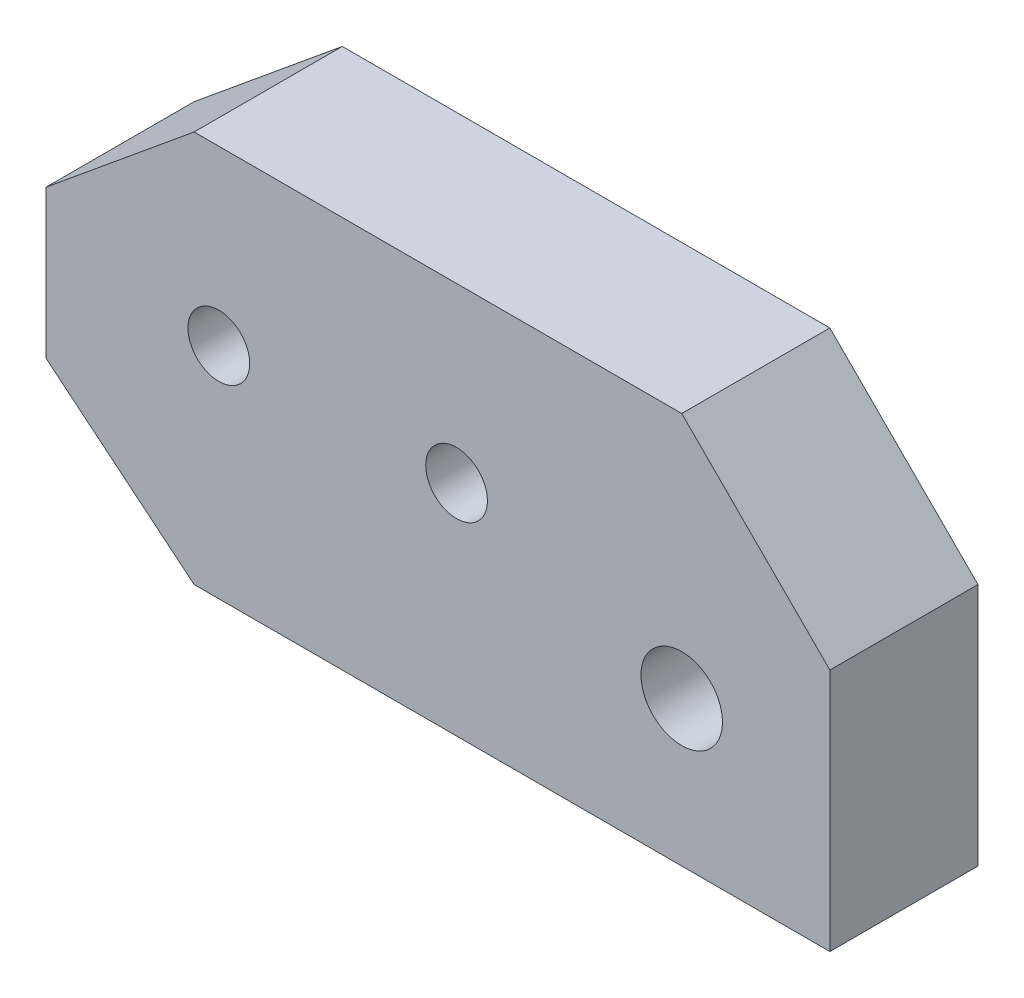
ISO-10303-21;
HEADER;
FILE_DESCRIPTION(('STEP AP214'),'2;1');
FILE_NAME('part.step','',(''),(''),'','','');
FILE_SCHEMA(('AUTOMOTIVE_DESIGN { 1 0 10303 214 1 1 1 1 }'));
ENDSEC;
DATA;
#1=APPLICATION_CONTEXT('core data for automotive mechanical design processes');
#2=APPLICATION_PROTOCOL_DEFINITION('international standard','automotive_design',2000,#1);
#3=PRODUCT_CONTEXT('',#1,'mechanical');
#4=PRODUCT('Part','Part','',(#3));
#5=PRODUCT_RELATED_PRODUCT_CATEGORY('part','',(#4));
#6=PRODUCT_DEFINITION_FORMATION('','',#4);
#7=PRODUCT_DEFINITION_CONTEXT('part definition',#1,'design');
#8=PRODUCT_DEFINITION('design','',#6,#7);
#9=PRODUCT_DEFINITION_SHAPE('','',#8);
#10=(LENGTH_UNIT() NAMED_UNIT(*) SI_UNIT(.MILLI.,.METRE.));
#11=(NAMED_UNIT(*) PLANE_ANGLE_UNIT() SI_UNIT($,.RADIAN.));
#12=(NAMED_UNIT(*) SI_UNIT($,.STERADIAN.) SOLID_ANGLE_UNIT());
#13=UNCERTAINTY_MEASURE_WITH_UNIT(LENGTH_MEASURE(1.E-05),#10,'distance_accuracy_value','');
#14=(GEOMETRIC_REPRESENTATION_CONTEXT(3) GLOBAL_UNCERTAINTY_ASSIGNED_CONTEXT((#13)) GLOBAL_UNIT_ASSIGNED_CONTEXT((#10,
#11,#12)) REPRESENTATION_CONTEXT('',''));
#15=CARTESIAN_POINT('',(0.,0.,0.));
#16=DIRECTION('',(0.,0.,1.));
#17=DIRECTION('',(1.,0.,0.));
#18=AXIS2_PLACEMENT_3D('',#15,#16,#17);
#19=CARTESIAN_POINT('',(0.,0.,-6.));
#20=DIRECTION('',(0.,0.,1.));
#21=DIRECTION('',(1.,0.,0.));
#22=AXIS2_PLACEMENT_3D('',#19,#20,#21);
#23=PLANE('',#22);
#24=CARTESIAN_POINT('',(19.7484392802478,-4.12500000000007,-6.));
#25=DIRECTION('',(0.,0.,-1.));
#26=DIRECTION('',(-1.,0.,0.));
#27=AXIS2_PLACEMENT_3D('',#24,#25,#26);
#28=CIRCLE('',#27,3.3);
#29=CARTESIAN_POINT('',(16.4484392802478,-4.12500000000007,-6.));
#30=VERTEX_POINT('',#29);
#31=EDGE_CURVE('E190',#30,#30,#28,.T.);
#32=ORIENTED_EDGE('',*,*,#31,.F.);
#33=EDGE_LOOP('',(#32));
#34=FACE_BOUND('',#33,.T.);
#35=DIRECTION('',(0.,1.,0.));
#36=VECTOR('',#35,1.);
#37=CARTESIAN_POINT('',(31.75,-15.875,-6.));
#38=LINE('',#37,#36);
#39=CARTESIAN_POINT('',(31.75,-15.875,-6.));
#40=VERTEX_POINT('',#39);
#41=CARTESIAN_POINT('',(31.75,3.87499999999999,-6.));
#42=VERTEX_POINT('',#41);
#43=EDGE_CURVE('E140',#40,#42,#38,.T.);
#44=ORIENTED_EDGE('',*,*,#43,.F.);
#45=DIRECTION('',(1.,0.,0.));
#46=VECTOR('',#45,1.);
#47=CARTESIAN_POINT('',(31.75,-15.875,-6.));
#48=LINE('',#47,#46);
#49=CARTESIAN_POINT('',(-19.75,-15.875,-6.));
#50=VERTEX_POINT('',#49);
#51=EDGE_CURVE('E98',#50,#40,#48,.T.);
#52=ORIENTED_EDGE('',*,*,#51,.F.);
#53=DIRECTION('',(0.772162363536845,-0.635425278327195,0.));
#54=VECTOR('',#53,1.);
#55=CARTESIAN_POINT('',(-31.75,-6.,-6.));
#56=LINE('',#55,#54);
#57=CARTESIAN_POINT('',(-31.75,-6.,-6.));
#58=VERTEX_POINT('',#57);
#59=EDGE_CURVE('E92',#58,#50,#56,.T.);
#60=ORIENTED_EDGE('',*,*,#59,.F.);
#61=DIRECTION('',(0.,-1.,0.));
#62=VECTOR('',#61,1.);
#63=CARTESIAN_POINT('',(-31.75,6.,-6.));
#64=LINE('',#63,#62);
#65=CARTESIAN_POINT('',(-31.75,6.,-6.));
#66=VERTEX_POINT('',#65);
#67=EDGE_CURVE('E130',#66,#58,#64,.T.);
#68=ORIENTED_EDGE('',*,*,#67,.F.);
#69=DIRECTION('',(-0.772162363536845,-0.635425278327195,0.));
#70=VECTOR('',#69,1.);
#71=CARTESIAN_POINT('',(-31.75,6.,-6.));
#72=LINE('',#71,#70);
#73=CARTESIAN_POINT('',(-19.75,15.875,-6.));
#74=VERTEX_POINT('',#73);
#75=EDGE_CURVE('E148',#74,#66,#72,.T.);
#76=ORIENTED_EDGE('',*,*,#75,.F.);
#77=DIRECTION('',(-1.,0.,0.));
#78=VECTOR('',#77,1.);
#79=CARTESIAN_POINT('',(19.75,15.875,-6.));
#80=LINE('',#79,#78);
#81=CARTESIAN_POINT('',(19.75,15.875,-6.));
#82=VERTEX_POINT('',#81);
#83=EDGE_CURVE('E146',#82,#74,#80,.T.);
#84=ORIENTED_EDGE('',*,*,#83,.F.);
#85=DIRECTION('',(-0.707106781186548,0.707106781186547,0.));
#86=VECTOR('',#85,1.);
#87=CARTESIAN_POINT('',(19.75,15.875,-6.));
#88=LINE('',#87,#86);
#89=EDGE_CURVE('E143',#42,#82,#88,.T.);
#90=ORIENTED_EDGE('',*,*,#89,.F.);
#91=EDGE_LOOP('',(#44,#52,#60,#68,#76,#84,#90));
#92=FACE_BOUND('',#91,.T.);
#93=CARTESIAN_POINT('',(1.51,1.87499999999999,-6.));
#94=DIRECTION('',(0.,0.,-1.));
#95=DIRECTION('',(-1.,0.,0.));
#96=AXIS2_PLACEMENT_3D('',#93,#94,#95);
#97=CIRCLE('',#96,2.5);
#98=CARTESIAN_POINT('',(-0.989999999999994,1.87499999999999,-6.));
#99=VERTEX_POINT('',#98);
#100=EDGE_CURVE('E178',#99,#99,#97,.T.);
#101=ORIENTED_EDGE('',*,*,#100,.F.);
#102=EDGE_LOOP('',(#101));
#103=FACE_BOUND('',#102,.T.);
#104=CARTESIAN_POINT('',(-17.75,1.87499999999999,-6.));
#105=DIRECTION('',(0.,0.,-1.));
#106=DIRECTION('',(-1.,0.,0.));
#107=AXIS2_PLACEMENT_3D('',#104,#105,#106);
#108=CIRCLE('',#107,2.5);
#109=CARTESIAN_POINT('',(-20.25,1.87499999999999,-6.));
#110=VERTEX_POINT('',#109);
#111=EDGE_CURVE('E184',#110,#110,#108,.T.);
#112=ORIENTED_EDGE('',*,*,#111,.F.);
#113=EDGE_LOOP('',(#112));
#114=FACE_BOUND('',#113,.T.);
#115=ADVANCED_FACE('F49',(#34,#92,#103,#114),#23,.F.);
#116=CARTESIAN_POINT('',(31.75,-15.875,6.));
#117=DIRECTION('',(-1.,0.,0.));
#118=DIRECTION('',(0.,0.,1.));
#119=AXIS2_PLACEMENT_3D('',#116,#117,#118);
#120=PLANE('',#119);
#121=ORIENTED_EDGE('',*,*,#43,.T.);
#122=DIRECTION('',(0.,0.,-1.));
#123=VECTOR('',#122,1.);
#124=CARTESIAN_POINT('',(31.75,3.87499999999999,6.));
#125=LINE('',#124,#123);
#126=CARTESIAN_POINT('',(31.75,3.87499999999999,6.));
#127=VERTEX_POINT('',#126);
#128=EDGE_CURVE('E11',#127,#42,#125,.T.);
#129=ORIENTED_EDGE('',*,*,#128,.F.);
#130=DIRECTION('',(0.,1.,0.));
#131=VECTOR('',#130,1.);
#132=CARTESIAN_POINT('',(31.75,-15.875,6.));
#133=LINE('',#132,#131);
#134=CARTESIAN_POINT('',(31.75,-15.875,6.));
#135=VERTEX_POINT('',#134);
#136=EDGE_CURVE('E153',#135,#127,#133,.T.);
#137=ORIENTED_EDGE('',*,*,#136,.F.);
#138=DIRECTION('',(0.,0.,-1.));
#139=VECTOR('',#138,1.);
#140=CARTESIAN_POINT('',(31.75,-15.875,6.));
#141=LINE('',#140,#139);
#142=EDGE_CURVE('E136',#135,#40,#141,.T.);
#143=ORIENTED_EDGE('',*,*,#142,.T.);
#144=EDGE_LOOP('',(#121,#129,#137,#143));
#145=FACE_BOUND('',#144,.T.);
#146=ADVANCED_FACE('F51',(#145),#120,.F.);
#147=CARTESIAN_POINT('',(19.75,15.875,6.));
#148=DIRECTION('',(-0.707106781186547,-0.707106781186548,0.));
#149=DIRECTION('',(0.707106781186548,-0.707106781186547,0.));
#150=AXIS2_PLACEMENT_3D('',#147,#148,#149);
#151=PLANE('',#150);
#152=ORIENTED_EDGE('',*,*,#89,.T.);
#153=DIRECTION('',(0.,0.,-1.));
#154=VECTOR('',#153,1.);
#155=CARTESIAN_POINT('',(19.75,15.875,6.));
#156=LINE('',#155,#154);
#157=CARTESIAN_POINT('',(19.75,15.875,6.));
#158=VERTEX_POINT('',#157);
#159=EDGE_CURVE('E58',#158,#82,#156,.T.);
#160=ORIENTED_EDGE('',*,*,#159,.F.);
#161=DIRECTION('',(-0.707106781186548,0.707106781186547,0.));
#162=VECTOR('',#161,1.);
#163=CARTESIAN_POINT('',(19.75,15.875,6.));
#164=LINE('',#163,#162);
#165=EDGE_CURVE('E106',#127,#158,#164,.T.);
#166=ORIENTED_EDGE('',*,*,#165,.F.);
#167=ORIENTED_EDGE('',*,*,#128,.T.);
#168=EDGE_LOOP('',(#152,#160,#166,#167));
#169=FACE_BOUND('',#168,.T.);
#170=ADVANCED_FACE('F203',(#169),#151,.F.);
#171=CARTESIAN_POINT('',(19.75,15.875,6.));
#172=DIRECTION('',(0.,-1.,0.));
#173=DIRECTION('',(1.,0.,0.));
#174=AXIS2_PLACEMENT_3D('',#171,#172,#173);
#175=PLANE('',#174);
#176=ORIENTED_EDGE('',*,*,#83,.T.);
#177=DIRECTION('',(0.,0.,-1.));
#178=VECTOR('',#177,1.);
#179=CARTESIAN_POINT('',(-19.75,15.875,6.));
#180=LINE('',#179,#178);
#181=CARTESIAN_POINT('',(-19.75,15.875,6.));
#182=VERTEX_POINT('',#181);
#183=EDGE_CURVE('E157',#182,#74,#180,.T.);
#184=ORIENTED_EDGE('',*,*,#183,.F.);
#185=DIRECTION('',(-1.,0.,0.));
#186=VECTOR('',#185,1.);
#187=CARTESIAN_POINT('',(19.75,15.875,6.));
#188=LINE('',#187,#186);
#189=EDGE_CURVE('E165',#158,#182,#188,.T.);
#190=ORIENTED_EDGE('',*,*,#189,.F.);
#191=ORIENTED_EDGE('',*,*,#159,.T.);
#192=EDGE_LOOP('',(#176,#184,#190,#191));
#193=FACE_BOUND('',#192,.T.);
#194=ADVANCED_FACE('F163',(#193),#175,.F.);
#195=CARTESIAN_POINT('',(-31.75,6.,6.));
#196=DIRECTION('',(0.635425278327195,-0.772162363536845,0.));
#197=DIRECTION('',(0.772162363536845,0.635425278327195,0.));
#198=AXIS2_PLACEMENT_3D('',#195,#196,#197);
#199=PLANE('',#198);
#200=ORIENTED_EDGE('',*,*,#75,.T.);
#201=DIRECTION('',(0.,0.,-1.));
#202=VECTOR('',#201,1.);
#203=CARTESIAN_POINT('',(-31.75,6.,6.));
#204=LINE('',#203,#202);
#205=CARTESIAN_POINT('',(-31.75,6.,6.));
#206=VERTEX_POINT('',#205);
#207=EDGE_CURVE('E131',#206,#66,#204,.T.);
#208=ORIENTED_EDGE('',*,*,#207,.F.);
#209=DIRECTION('',(-0.772162363536845,-0.635425278327195,0.));
#210=VECTOR('',#209,1.);
#211=CARTESIAN_POINT('',(-31.75,6.,6.));
#212=LINE('',#211,#210);
#213=EDGE_CURVE('E122',#182,#206,#212,.T.);
#214=ORIENTED_EDGE('',*,*,#213,.F.);
#215=ORIENTED_EDGE('',*,*,#183,.T.);
#216=EDGE_LOOP('',(#200,#208,#214,#215));
#217=FACE_BOUND('',#216,.T.);
#218=ADVANCED_FACE('F171',(#217),#199,.F.);
#219=CARTESIAN_POINT('',(-31.75,6.,6.));
#220=DIRECTION('',(1.,0.,0.));
#221=DIRECTION('',(0.,0.,-1.));
#222=AXIS2_PLACEMENT_3D('',#219,#220,#221);
#223=PLANE('',#222);
#224=ORIENTED_EDGE('',*,*,#67,.T.);
#225=DIRECTION('',(0.,0.,-1.));
#226=VECTOR('',#225,1.);
#227=CARTESIAN_POINT('',(-31.75,-6.,6.));
#228=LINE('',#227,#226);
#229=CARTESIAN_POINT('',(-31.75,-6.,6.));
#230=VERTEX_POINT('',#229);
#231=EDGE_CURVE('E127',#230,#58,#228,.T.);
#232=ORIENTED_EDGE('',*,*,#231,.F.);
#233=DIRECTION('',(0.,-1.,0.));
#234=VECTOR('',#233,1.);
#235=CARTESIAN_POINT('',(-31.75,6.,6.));
#236=LINE('',#235,#234);
#237=EDGE_CURVE('E116',#206,#230,#236,.T.);
#238=ORIENTED_EDGE('',*,*,#237,.F.);
#239=ORIENTED_EDGE('',*,*,#207,.T.);
#240=EDGE_LOOP('',(#224,#232,#238,#239));
#241=FACE_BOUND('',#240,.T.);
#242=ADVANCED_FACE('F128',(#241),#223,.F.);
#243=CARTESIAN_POINT('',(-31.75,-6.,6.));
#244=DIRECTION('',(0.635425278327195,0.772162363536845,0.));
#245=DIRECTION('',(-0.772162363536845,0.635425278327195,0.));
#246=AXIS2_PLACEMENT_3D('',#243,#244,#245);
#247=PLANE('',#246);
#248=ORIENTED_EDGE('',*,*,#59,.T.);
#249=DIRECTION('',(0.,0.,-1.));
#250=VECTOR('',#249,1.);
#251=CARTESIAN_POINT('',(-19.75,-15.875,6.));
#252=LINE('',#251,#250);
#253=CARTESIAN_POINT('',(-19.75,-15.875,6.));
#254=VERTEX_POINT('',#253);
#255=EDGE_CURVE('E132',#254,#50,#252,.T.);
#256=ORIENTED_EDGE('',*,*,#255,.F.);
#257=DIRECTION('',(0.772162363536845,-0.635425278327195,0.));
#258=VECTOR('',#257,1.);
#259=CARTESIAN_POINT('',(-31.75,-6.,6.));
#260=LINE('',#259,#258);
#261=EDGE_CURVE('E120',#230,#254,#260,.T.);
#262=ORIENTED_EDGE('',*,*,#261,.F.);
#263=ORIENTED_EDGE('',*,*,#231,.T.);
#264=EDGE_LOOP('',(#248,#256,#262,#263));
#265=FACE_BOUND('',#264,.T.);
#266=ADVANCED_FACE('F134',(#265),#247,.F.);
#267=CARTESIAN_POINT('',(31.75,-15.875,6.));
#268=DIRECTION('',(0.,1.,0.));
#269=DIRECTION('',(-1.,0.,0.));
#270=AXIS2_PLACEMENT_3D('',#267,#268,#269);
#271=PLANE('',#270);
#272=ORIENTED_EDGE('',*,*,#51,.T.);
#273=ORIENTED_EDGE('',*,*,#142,.F.);
#274=DIRECTION('',(1.,0.,0.));
#275=VECTOR('',#274,1.);
#276=CARTESIAN_POINT('',(31.75,-15.875,6.));
#277=LINE('',#276,#275);
#278=EDGE_CURVE('E66',#254,#135,#277,.T.);
#279=ORIENTED_EDGE('',*,*,#278,.F.);
#280=ORIENTED_EDGE('',*,*,#255,.T.);
#281=EDGE_LOOP('',(#272,#273,#279,#280));
#282=FACE_BOUND('',#281,.T.);
#283=ADVANCED_FACE('F208',(#282),#271,.F.);
#284=CARTESIAN_POINT('',(0.,0.,6.));
#285=DIRECTION('',(0.,0.,1.));
#286=DIRECTION('',(1.,0.,0.));
#287=AXIS2_PLACEMENT_3D('',#284,#285,#286);
#288=PLANE('',#287);
#289=CARTESIAN_POINT('',(19.7484392802478,-4.12500000000007,6.));
#290=DIRECTION('',(0.,0.,-1.));
#291=DIRECTION('',(-1.,0.,0.));
#292=AXIS2_PLACEMENT_3D('',#289,#290,#291);
#293=CIRCLE('',#292,3.3);
#294=CARTESIAN_POINT('',(16.4484392802478,-4.12500000000007,6.));
#295=VERTEX_POINT('',#294);
#296=EDGE_CURVE('E187',#295,#295,#293,.T.);
#297=ORIENTED_EDGE('',*,*,#296,.T.);
#298=EDGE_LOOP('',(#297));
#299=FACE_BOUND('',#298,.T.);
#300=CARTESIAN_POINT('',(-17.75,1.87499999999999,6.));
#301=DIRECTION('',(0.,0.,-1.));
#302=DIRECTION('',(-1.,0.,0.));
#303=AXIS2_PLACEMENT_3D('',#300,#301,#302);
#304=CIRCLE('',#303,2.5);
#305=CARTESIAN_POINT('',(-20.25,1.87499999999999,6.));
#306=VERTEX_POINT('',#305);
#307=EDGE_CURVE('E181',#306,#306,#304,.T.);
#308=ORIENTED_EDGE('',*,*,#307,.T.);
#309=EDGE_LOOP('',(#308));
#310=FACE_BOUND('',#309,.T.);
#311=CARTESIAN_POINT('',(1.51,1.87499999999999,6.));
#312=DIRECTION('',(0.,0.,-1.));
#313=DIRECTION('',(-1.,0.,0.));
#314=AXIS2_PLACEMENT_3D('',#311,#312,#313);
#315=CIRCLE('',#314,2.5);
#316=CARTESIAN_POINT('',(-0.989999999999992,1.87499999999999,6.));
#317=VERTEX_POINT('',#316);
#318=EDGE_CURVE('E144',#317,#317,#315,.T.);
#319=ORIENTED_EDGE('',*,*,#318,.T.);
#320=EDGE_LOOP('',(#319));
#321=FACE_BOUND('',#320,.T.);
#322=ORIENTED_EDGE('',*,*,#136,.T.);
#323=ORIENTED_EDGE('',*,*,#165,.T.);
#324=ORIENTED_EDGE('',*,*,#189,.T.);
#325=ORIENTED_EDGE('',*,*,#213,.T.);
#326=ORIENTED_EDGE('',*,*,#237,.T.);
#327=ORIENTED_EDGE('',*,*,#261,.T.);
#328=ORIENTED_EDGE('',*,*,#278,.T.);
#329=EDGE_LOOP('',(#322,#323,#324,#325,#326,#327,#328));
#330=FACE_BOUND('',#329,.T.);
#331=ADVANCED_FACE('F118',(#299,#310,#321,#330),#288,.T.);
#332=CARTESIAN_POINT('',(1.51,1.87499999999999,-6.));
#333=DIRECTION('',(0.,0.,-1.));
#334=DIRECTION('',(-1.,0.,0.));
#335=AXIS2_PLACEMENT_3D('',#332,#333,#334);
#336=CYLINDRICAL_SURFACE('',#335,2.5);
#337=ORIENTED_EDGE('',*,*,#318,.F.);
#338=EDGE_LOOP('',(#337));
#339=FACE_BOUND('',#338,.T.);
#340=ORIENTED_EDGE('',*,*,#100,.T.);
#341=EDGE_LOOP('',(#340));
#342=FACE_BOUND('',#341,.T.);
#343=ADVANCED_FACE('F255',(#339,#342),#336,.F.);
#344=CARTESIAN_POINT('',(-17.75,1.87499999999999,-6.));
#345=DIRECTION('',(0.,0.,-1.));
#346=DIRECTION('',(-1.,0.,0.));
#347=AXIS2_PLACEMENT_3D('',#344,#345,#346);
#348=CYLINDRICAL_SURFACE('',#347,2.5);
#349=ORIENTED_EDGE('',*,*,#307,.F.);
#350=EDGE_LOOP('',(#349));
#351=FACE_BOUND('',#350,.T.);
#352=ORIENTED_EDGE('',*,*,#111,.T.);
#353=EDGE_LOOP('',(#352));
#354=FACE_BOUND('',#353,.T.);
#355=ADVANCED_FACE('F260',(#351,#354),#348,.F.);
#356=CARTESIAN_POINT('',(19.7484392802478,-4.12500000000007,-6.));
#357=DIRECTION('',(0.,0.,-1.));
#358=DIRECTION('',(-1.,0.,0.));
#359=AXIS2_PLACEMENT_3D('',#356,#357,#358);
#360=CYLINDRICAL_SURFACE('',#359,3.3);
#361=ORIENTED_EDGE('',*,*,#296,.F.);
#362=EDGE_LOOP('',(#361));
#363=FACE_BOUND('',#362,.T.);
#364=ORIENTED_EDGE('',*,*,#31,.T.);
#365=EDGE_LOOP('',(#364));
#366=FACE_BOUND('',#365,.T.);
#367=ADVANCED_FACE('F194',(#363,#366),#360,.F.);
#368=CLOSED_SHELL('',(#115,#146,#170,#194,#218,#242,#266,#283,#331,#343,#355,#367));
#369=MANIFOLD_SOLID_BREP('B2',#368);
#370=ADVANCED_BREP_SHAPE_REPRESENTATION('',(#18,#369),#14);
#371=SHAPE_DEFINITION_REPRESENTATION(#9,#370);
ENDSEC;
END-ISO-10303-21;
